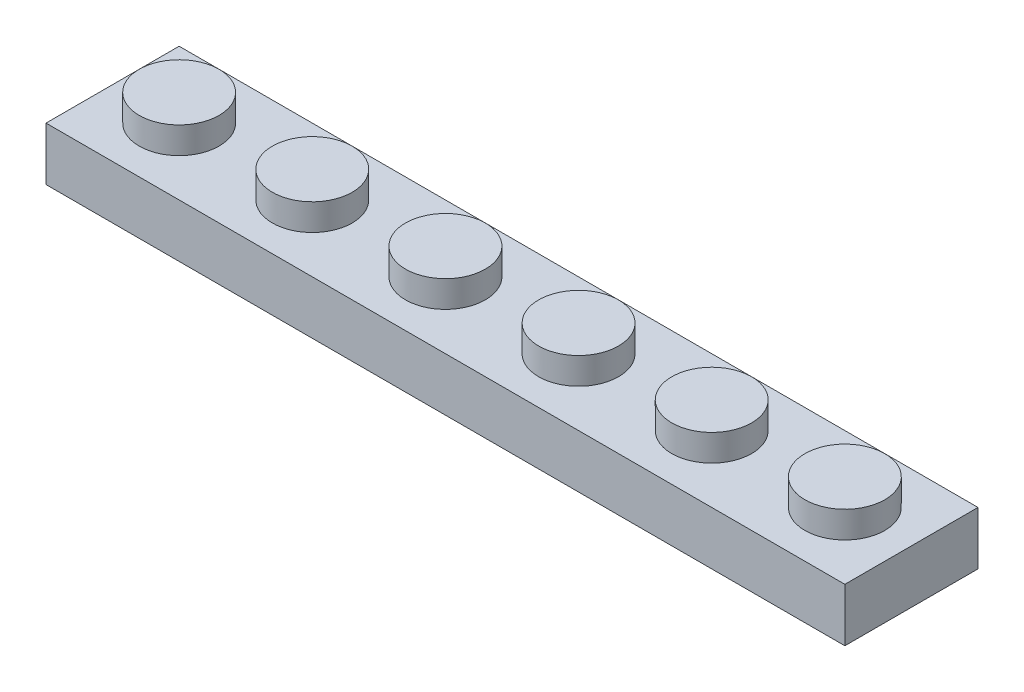
ISO-10303-21;
HEADER;
FILE_DESCRIPTION(('STEP AP214'),'2;1');
FILE_NAME('part.step','',(''),(''),'','','');
FILE_SCHEMA(('AUTOMOTIVE_DESIGN { 1 0 10303 214 1 1 1 1 }'));
ENDSEC;
DATA;
#1=APPLICATION_CONTEXT('core data for automotive mechanical design processes');
#2=APPLICATION_PROTOCOL_DEFINITION('international standard','automotive_design',2000,#1);
#3=PRODUCT_CONTEXT('',#1,'mechanical');
#4=PRODUCT('Part','Part','',(#3));
#5=PRODUCT_RELATED_PRODUCT_CATEGORY('part','',(#4));
#6=PRODUCT_DEFINITION_FORMATION('','',#4);
#7=PRODUCT_DEFINITION_CONTEXT('part definition',#1,'design');
#8=PRODUCT_DEFINITION('design','',#6,#7);
#9=PRODUCT_DEFINITION_SHAPE('','',#8);
#10=(LENGTH_UNIT() NAMED_UNIT(*) SI_UNIT(.MILLI.,.METRE.));
#11=(NAMED_UNIT(*) PLANE_ANGLE_UNIT() SI_UNIT($,.RADIAN.));
#12=(NAMED_UNIT(*) SI_UNIT($,.STERADIAN.) SOLID_ANGLE_UNIT());
#13=UNCERTAINTY_MEASURE_WITH_UNIT(LENGTH_MEASURE(1.E-05),#10,'distance_accuracy_value','');
#14=(GEOMETRIC_REPRESENTATION_CONTEXT(3) GLOBAL_UNCERTAINTY_ASSIGNED_CONTEXT((#13)) GLOBAL_UNIT_ASSIGNED_CONTEXT((#10,
#11,#12)) REPRESENTATION_CONTEXT('',''));
#15=CARTESIAN_POINT('',(0.,0.,0.));
#16=DIRECTION('',(0.,0.,1.));
#17=DIRECTION('',(1.,0.,0.));
#18=AXIS2_PLACEMENT_3D('',#15,#16,#17);
#19=CARTESIAN_POINT('',(44.,1.6,4.));
#20=DIRECTION('',(-1.,0.,0.));
#21=DIRECTION('',(0.,0.,1.));
#22=AXIS2_PLACEMENT_3D('',#19,#20,#21);
#23=PLANE('',#22);
#24=DIRECTION('',(0.,0.,-1.));
#25=VECTOR('',#24,1.);
#26=CARTESIAN_POINT('',(44.,3.2,4.));
#27=LINE('',#26,#25);
#28=CARTESIAN_POINT('',(44.,3.2,4.));
#29=VERTEX_POINT('',#28);
#30=CARTESIAN_POINT('',(44.,3.2,-4.));
#31=VERTEX_POINT('',#30);
#32=EDGE_CURVE('E11',#29,#31,#27,.T.);
#33=ORIENTED_EDGE('',*,*,#32,.F.);
#34=DIRECTION('',(0.,1.,0.));
#35=VECTOR('',#34,1.);
#36=CARTESIAN_POINT('',(44.,0.,4.));
#37=LINE('',#36,#35);
#38=CARTESIAN_POINT('',(44.,0.,4.));
#39=VERTEX_POINT('',#38);
#40=EDGE_CURVE('E165',#39,#29,#37,.T.);
#41=ORIENTED_EDGE('',*,*,#40,.F.);
#42=DIRECTION('',(0.,0.,-1.));
#43=VECTOR('',#42,1.);
#44=CARTESIAN_POINT('',(44.,0.,4.));
#45=LINE('',#44,#43);
#46=CARTESIAN_POINT('',(44.,0.,-4.));
#47=VERTEX_POINT('',#46);
#48=EDGE_CURVE('E174',#39,#47,#45,.T.);
#49=ORIENTED_EDGE('',*,*,#48,.T.);
#50=DIRECTION('',(0.,-1.,0.));
#51=VECTOR('',#50,1.);
#52=CARTESIAN_POINT('',(44.,1.6,-4.));
#53=LINE('',#52,#51);
#54=EDGE_CURVE('E226',#31,#47,#53,.T.);
#55=ORIENTED_EDGE('',*,*,#54,.F.);
#56=EDGE_LOOP('',(#33,#41,#49,#55));
#57=FACE_BOUND('',#56,.T.);
#58=ADVANCED_FACE('F43',(#57),#23,.F.);
#59=CARTESIAN_POINT('',(20.,3.2,4.));
#60=DIRECTION('',(0.,-1.,0.));
#61=DIRECTION('',(0.,0.,-1.));
#62=AXIS2_PLACEMENT_3D('',#59,#60,#61);
#63=PLANE('',#62);
#64=DIRECTION('',(1.,0.,0.));
#65=VECTOR('',#64,1.);
#66=CARTESIAN_POINT('',(20.,3.2,4.));
#67=LINE('',#66,#65);
#68=CARTESIAN_POINT('',(-4.,3.2,4.));
#69=VERTEX_POINT('',#68);
#70=EDGE_CURVE('E205',#69,#29,#67,.T.);
#71=ORIENTED_EDGE('',*,*,#70,.T.);
#72=ORIENTED_EDGE('',*,*,#32,.T.);
#73=DIRECTION('',(1.,0.,0.));
#74=VECTOR('',#73,1.);
#75=CARTESIAN_POINT('',(20.,3.2,-4.));
#76=LINE('',#75,#74);
#77=CARTESIAN_POINT('',(-4.,3.2,-4.));
#78=VERTEX_POINT('',#77);
#79=EDGE_CURVE('E183',#78,#31,#76,.T.);
#80=ORIENTED_EDGE('',*,*,#79,.F.);
#81=DIRECTION('',(0.,0.,-1.));
#82=VECTOR('',#81,1.);
#83=CARTESIAN_POINT('',(-4.,3.2,4.));
#84=LINE('',#83,#82);
#85=EDGE_CURVE('E53',#69,#78,#84,.T.);
#86=ORIENTED_EDGE('',*,*,#85,.F.);
#87=EDGE_LOOP('',(#71,#72,#80,#86));
#88=FACE_BOUND('',#87,.T.);
#89=CARTESIAN_POINT('',(0.,3.2,0.));
#90=DIRECTION('',(0.,-1.,0.));
#91=DIRECTION('',(1.,0.,0.));
#92=AXIS2_PLACEMENT_3D('',#89,#90,#91);
#93=CIRCLE('',#92,2.4);
#94=CARTESIAN_POINT('',(-2.4,3.2,0.));
#95=VERTEX_POINT('',#94);
#96=EDGE_CURVE('E224',#95,#95,#93,.T.);
#97=ORIENTED_EDGE('',*,*,#96,.T.);
#98=EDGE_LOOP('',(#97));
#99=FACE_BOUND('',#98,.T.);
#100=CARTESIAN_POINT('',(8.,3.2,0.));
#101=DIRECTION('',(0.,-1.,0.));
#102=DIRECTION('',(1.,0.,0.));
#103=AXIS2_PLACEMENT_3D('',#100,#101,#102);
#104=CIRCLE('',#103,2.4);
#105=CARTESIAN_POINT('',(5.6,3.2,0.));
#106=VERTEX_POINT('',#105);
#107=EDGE_CURVE('E216',#106,#106,#104,.T.);
#108=ORIENTED_EDGE('',*,*,#107,.T.);
#109=EDGE_LOOP('',(#108));
#110=FACE_BOUND('',#109,.T.);
#111=CARTESIAN_POINT('',(16.,3.2,0.));
#112=DIRECTION('',(0.,-1.,0.));
#113=DIRECTION('',(1.,0.,0.));
#114=AXIS2_PLACEMENT_3D('',#111,#112,#113);
#115=CIRCLE('',#114,2.4);
#116=CARTESIAN_POINT('',(13.6,3.2,0.));
#117=VERTEX_POINT('',#116);
#118=EDGE_CURVE('E206',#117,#117,#115,.T.);
#119=ORIENTED_EDGE('',*,*,#118,.T.);
#120=EDGE_LOOP('',(#119));
#121=FACE_BOUND('',#120,.T.);
#122=CARTESIAN_POINT('',(24.,3.2,0.));
#123=DIRECTION('',(0.,-1.,0.));
#124=DIRECTION('',(1.,0.,0.));
#125=AXIS2_PLACEMENT_3D('',#122,#123,#124);
#126=CIRCLE('',#125,2.4);
#127=CARTESIAN_POINT('',(21.6,3.2,0.));
#128=VERTEX_POINT('',#127);
#129=EDGE_CURVE('E228',#128,#128,#126,.T.);
#130=ORIENTED_EDGE('',*,*,#129,.T.);
#131=EDGE_LOOP('',(#130));
#132=FACE_BOUND('',#131,.T.);
#133=CARTESIAN_POINT('',(32.,3.2,0.));
#134=DIRECTION('',(0.,-1.,0.));
#135=DIRECTION('',(1.,0.,0.));
#136=AXIS2_PLACEMENT_3D('',#133,#134,#135);
#137=CIRCLE('',#136,2.4);
#138=CARTESIAN_POINT('',(29.6,3.2,0.));
#139=VERTEX_POINT('',#138);
#140=EDGE_CURVE('E191',#139,#139,#137,.T.);
#141=ORIENTED_EDGE('',*,*,#140,.T.);
#142=EDGE_LOOP('',(#141));
#143=FACE_BOUND('',#142,.T.);
#144=CARTESIAN_POINT('',(40.,3.2,0.));
#145=DIRECTION('',(0.,-1.,0.));
#146=DIRECTION('',(1.,0.,0.));
#147=AXIS2_PLACEMENT_3D('',#144,#145,#146);
#148=CIRCLE('',#147,2.4);
#149=CARTESIAN_POINT('',(37.6,3.2,0.));
#150=VERTEX_POINT('',#149);
#151=EDGE_CURVE('E141',#150,#150,#148,.T.);
#152=ORIENTED_EDGE('',*,*,#151,.T.);
#153=EDGE_LOOP('',(#152));
#154=FACE_BOUND('',#153,.T.);
#155=ADVANCED_FACE('F242',(#88,#99,#110,#121,#132,#143,#154),#63,.F.);
#156=CARTESIAN_POINT('',(-4.,1.6,4.));
#157=DIRECTION('',(1.,0.,0.));
#158=DIRECTION('',(0.,0.,-1.));
#159=AXIS2_PLACEMENT_3D('',#156,#157,#158);
#160=PLANE('',#159);
#161=DIRECTION('',(0.,0.,-1.));
#162=VECTOR('',#161,1.);
#163=CARTESIAN_POINT('',(-4.,0.,4.));
#164=LINE('',#163,#162);
#165=CARTESIAN_POINT('',(-4.,0.,4.));
#166=VERTEX_POINT('',#165);
#167=CARTESIAN_POINT('',(-4.,0.,-4.));
#168=VERTEX_POINT('',#167);
#169=EDGE_CURVE('E47',#166,#168,#164,.T.);
#170=ORIENTED_EDGE('',*,*,#169,.F.);
#171=DIRECTION('',(0.,1.,0.));
#172=VECTOR('',#171,1.);
#173=CARTESIAN_POINT('',(-4.,0.,4.));
#174=LINE('',#173,#172);
#175=EDGE_CURVE('E167',#166,#69,#174,.T.);
#176=ORIENTED_EDGE('',*,*,#175,.T.);
#177=ORIENTED_EDGE('',*,*,#85,.T.);
#178=DIRECTION('',(0.,1.,0.));
#179=VECTOR('',#178,1.);
#180=CARTESIAN_POINT('',(-4.,1.6,-4.));
#181=LINE('',#180,#179);
#182=EDGE_CURVE('E190',#168,#78,#181,.T.);
#183=ORIENTED_EDGE('',*,*,#182,.F.);
#184=EDGE_LOOP('',(#170,#176,#177,#183));
#185=FACE_BOUND('',#184,.T.);
#186=ADVANCED_FACE('F276',(#185),#160,.F.);
#187=CARTESIAN_POINT('',(20.,0.,4.));
#188=DIRECTION('',(0.,1.,0.));
#189=DIRECTION('',(0.,0.,1.));
#190=AXIS2_PLACEMENT_3D('',#187,#188,#189);
#191=PLANE('',#190);
#192=CARTESIAN_POINT('',(0.,0.,0.));
#193=DIRECTION('',(0.,1.,0.));
#194=DIRECTION('',(1.,0.,0.));
#195=AXIS2_PLACEMENT_3D('',#192,#193,#194);
#196=CIRCLE('',#195,2.4);
#197=CARTESIAN_POINT('',(-2.4,0.,0.));
#198=VERTEX_POINT('',#197);
#199=EDGE_CURVE('E100',#198,#198,#196,.T.);
#200=ORIENTED_EDGE('',*,*,#199,.T.);
#201=EDGE_LOOP('',(#200));
#202=FACE_BOUND('',#201,.T.);
#203=CARTESIAN_POINT('',(8.,0.,0.));
#204=DIRECTION('',(0.,1.,0.));
#205=DIRECTION('',(1.,0.,0.));
#206=AXIS2_PLACEMENT_3D('',#203,#204,#205);
#207=CIRCLE('',#206,2.4);
#208=CARTESIAN_POINT('',(5.6,0.,0.));
#209=VERTEX_POINT('',#208);
#210=EDGE_CURVE('E194',#209,#209,#207,.T.);
#211=ORIENTED_EDGE('',*,*,#210,.T.);
#212=EDGE_LOOP('',(#211));
#213=FACE_BOUND('',#212,.T.);
#214=CARTESIAN_POINT('',(16.,0.,0.));
#215=DIRECTION('',(0.,1.,0.));
#216=DIRECTION('',(1.,0.,0.));
#217=AXIS2_PLACEMENT_3D('',#214,#215,#216);
#218=CIRCLE('',#217,2.4);
#219=CARTESIAN_POINT('',(13.6,0.,0.));
#220=VERTEX_POINT('',#219);
#221=EDGE_CURVE('E211',#220,#220,#218,.T.);
#222=ORIENTED_EDGE('',*,*,#221,.T.);
#223=EDGE_LOOP('',(#222));
#224=FACE_BOUND('',#223,.T.);
#225=CARTESIAN_POINT('',(24.,0.,0.));
#226=DIRECTION('',(0.,1.,0.));
#227=DIRECTION('',(1.,0.,0.));
#228=AXIS2_PLACEMENT_3D('',#225,#226,#227);
#229=CIRCLE('',#228,2.4);
#230=CARTESIAN_POINT('',(21.6,0.,0.));
#231=VERTEX_POINT('',#230);
#232=EDGE_CURVE('E197',#231,#231,#229,.T.);
#233=ORIENTED_EDGE('',*,*,#232,.T.);
#234=EDGE_LOOP('',(#233));
#235=FACE_BOUND('',#234,.T.);
#236=CARTESIAN_POINT('',(32.,0.,0.));
#237=DIRECTION('',(0.,1.,0.));
#238=DIRECTION('',(1.,0.,0.));
#239=AXIS2_PLACEMENT_3D('',#236,#237,#238);
#240=CIRCLE('',#239,2.4);
#241=CARTESIAN_POINT('',(29.6,0.,0.));
#242=VERTEX_POINT('',#241);
#243=EDGE_CURVE('E219',#242,#242,#240,.T.);
#244=ORIENTED_EDGE('',*,*,#243,.T.);
#245=EDGE_LOOP('',(#244));
#246=FACE_BOUND('',#245,.T.);
#247=CARTESIAN_POINT('',(40.,0.,0.));
#248=DIRECTION('',(0.,1.,0.));
#249=DIRECTION('',(1.,0.,0.));
#250=AXIS2_PLACEMENT_3D('',#247,#248,#249);
#251=CIRCLE('',#250,2.4);
#252=CARTESIAN_POINT('',(37.6,0.,0.));
#253=VERTEX_POINT('',#252);
#254=EDGE_CURVE('E202',#253,#253,#251,.T.);
#255=ORIENTED_EDGE('',*,*,#254,.T.);
#256=EDGE_LOOP('',(#255));
#257=FACE_BOUND('',#256,.T.);
#258=ORIENTED_EDGE('',*,*,#48,.F.);
#259=DIRECTION('',(-1.,0.,0.));
#260=VECTOR('',#259,1.);
#261=CARTESIAN_POINT('',(0.,0.,4.));
#262=LINE('',#261,#260);
#263=EDGE_CURVE('E162',#39,#166,#262,.T.);
#264=ORIENTED_EDGE('',*,*,#263,.T.);
#265=ORIENTED_EDGE('',*,*,#169,.T.);
#266=DIRECTION('',(-1.,0.,0.));
#267=VECTOR('',#266,1.);
#268=CARTESIAN_POINT('',(20.,0.,-4.));
#269=LINE('',#268,#267);
#270=EDGE_CURVE('E179',#47,#168,#269,.T.);
#271=ORIENTED_EDGE('',*,*,#270,.F.);
#272=EDGE_LOOP('',(#258,#264,#265,#271));
#273=FACE_BOUND('',#272,.T.);
#274=ADVANCED_FACE('F177',(#202,#213,#224,#235,#246,#257,#273),#191,.F.);
#275=CARTESIAN_POINT('',(20.,1.6,-4.));
#276=DIRECTION('',(0.,0.,1.));
#277=DIRECTION('',(1.,0.,0.));
#278=AXIS2_PLACEMENT_3D('',#275,#276,#277);
#279=PLANE('',#278);
#280=ORIENTED_EDGE('',*,*,#54,.T.);
#281=ORIENTED_EDGE('',*,*,#270,.T.);
#282=ORIENTED_EDGE('',*,*,#182,.T.);
#283=ORIENTED_EDGE('',*,*,#79,.T.);
#284=EDGE_LOOP('',(#280,#281,#282,#283));
#285=FACE_BOUND('',#284,.T.);
#286=ADVANCED_FACE('F240',(#285),#279,.F.);
#287=CARTESIAN_POINT('',(0.,4.8,0.));
#288=DIRECTION('',(0.,1.,0.));
#289=DIRECTION('',(1.,0.,0.));
#290=AXIS2_PLACEMENT_3D('',#287,#288,#289);
#291=PLANE('',#290);
#292=CARTESIAN_POINT('',(0.,4.8,0.));
#293=DIRECTION('',(0.,1.,0.));
#294=DIRECTION('',(1.,0.,0.));
#295=AXIS2_PLACEMENT_3D('',#292,#293,#294);
#296=CIRCLE('',#295,2.4);
#297=CARTESIAN_POINT('',(2.4,4.8,0.));
#298=VERTEX_POINT('',#297);
#299=EDGE_CURVE('E186',#298,#298,#296,.T.);
#300=ORIENTED_EDGE('',*,*,#299,.T.);
#301=EDGE_LOOP('',(#300));
#302=FACE_BOUND('',#301,.T.);
#303=ADVANCED_FACE('F294',(#302),#291,.T.);
#304=CARTESIAN_POINT('',(0.,3.75,0.));
#305=DIRECTION('',(0.,-1.,0.));
#306=DIRECTION('',(1.,0.,0.));
#307=AXIS2_PLACEMENT_3D('',#304,#305,#306);
#308=CYLINDRICAL_SURFACE('',#307,2.4);
#309=ORIENTED_EDGE('',*,*,#96,.F.);
#310=EDGE_LOOP('',(#309));
#311=FACE_BOUND('',#310,.T.);
#312=ORIENTED_EDGE('',*,*,#299,.F.);
#313=EDGE_LOOP('',(#312));
#314=FACE_BOUND('',#313,.T.);
#315=ADVANCED_FACE('F292',(#311,#314),#308,.T.);
#316=CARTESIAN_POINT('',(8.,4.8,0.));
#317=DIRECTION('',(0.,1.,0.));
#318=DIRECTION('',(1.,0.,0.));
#319=AXIS2_PLACEMENT_3D('',#316,#317,#318);
#320=PLANE('',#319);
#321=CARTESIAN_POINT('',(8.,4.8,0.));
#322=DIRECTION('',(0.,1.,0.));
#323=DIRECTION('',(1.,0.,0.));
#324=AXIS2_PLACEMENT_3D('',#321,#322,#323);
#325=CIRCLE('',#324,2.4);
#326=CARTESIAN_POINT('',(10.4,4.8,0.));
#327=VERTEX_POINT('',#326);
#328=EDGE_CURVE('E208',#327,#327,#325,.T.);
#329=ORIENTED_EDGE('',*,*,#328,.T.);
#330=EDGE_LOOP('',(#329));
#331=FACE_BOUND('',#330,.T.);
#332=ADVANCED_FACE('F288',(#331),#320,.T.);
#333=CARTESIAN_POINT('',(8.,3.75,0.));
#334=DIRECTION('',(0.,-1.,0.));
#335=DIRECTION('',(1.,0.,0.));
#336=AXIS2_PLACEMENT_3D('',#333,#334,#335);
#337=CYLINDRICAL_SURFACE('',#336,2.4);
#338=ORIENTED_EDGE('',*,*,#107,.F.);
#339=EDGE_LOOP('',(#338));
#340=FACE_BOUND('',#339,.T.);
#341=ORIENTED_EDGE('',*,*,#328,.F.);
#342=EDGE_LOOP('',(#341));
#343=FACE_BOUND('',#342,.T.);
#344=ADVANCED_FACE('F291',(#340,#343),#337,.T.);
#345=CARTESIAN_POINT('',(16.,4.8,0.));
#346=DIRECTION('',(0.,1.,0.));
#347=DIRECTION('',(1.,0.,0.));
#348=AXIS2_PLACEMENT_3D('',#345,#346,#347);
#349=PLANE('',#348);
#350=CARTESIAN_POINT('',(16.,4.8,0.));
#351=DIRECTION('',(0.,1.,0.));
#352=DIRECTION('',(1.,0.,0.));
#353=AXIS2_PLACEMENT_3D('',#350,#351,#352);
#354=CIRCLE('',#353,2.4);
#355=CARTESIAN_POINT('',(18.4,4.8,0.));
#356=VERTEX_POINT('',#355);
#357=EDGE_CURVE('E209',#356,#356,#354,.T.);
#358=ORIENTED_EDGE('',*,*,#357,.T.);
#359=EDGE_LOOP('',(#358));
#360=FACE_BOUND('',#359,.T.);
#361=ADVANCED_FACE('F357',(#360),#349,.T.);
#362=CARTESIAN_POINT('',(16.,3.75,0.));
#363=DIRECTION('',(0.,-1.,0.));
#364=DIRECTION('',(1.,0.,0.));
#365=AXIS2_PLACEMENT_3D('',#362,#363,#364);
#366=CYLINDRICAL_SURFACE('',#365,2.4);
#367=ORIENTED_EDGE('',*,*,#118,.F.);
#368=EDGE_LOOP('',(#367));
#369=FACE_BOUND('',#368,.T.);
#370=ORIENTED_EDGE('',*,*,#357,.F.);
#371=EDGE_LOOP('',(#370));
#372=FACE_BOUND('',#371,.T.);
#373=ADVANCED_FACE('F285',(#369,#372),#366,.T.);
#374=CARTESIAN_POINT('',(24.,4.8,0.));
#375=DIRECTION('',(0.,1.,0.));
#376=DIRECTION('',(1.,0.,0.));
#377=AXIS2_PLACEMENT_3D('',#374,#375,#376);
#378=PLANE('',#377);
#379=CARTESIAN_POINT('',(24.,4.8,0.));
#380=DIRECTION('',(0.,1.,0.));
#381=DIRECTION('',(1.,0.,0.));
#382=AXIS2_PLACEMENT_3D('',#379,#380,#381);
#383=CIRCLE('',#382,2.4);
#384=CARTESIAN_POINT('',(26.4,4.8,0.));
#385=VERTEX_POINT('',#384);
#386=EDGE_CURVE('E193',#385,#385,#383,.T.);
#387=ORIENTED_EDGE('',*,*,#386,.T.);
#388=EDGE_LOOP('',(#387));
#389=FACE_BOUND('',#388,.T.);
#390=ADVANCED_FACE('F282',(#389),#378,.T.);
#391=CARTESIAN_POINT('',(24.,3.75,0.));
#392=DIRECTION('',(0.,-1.,0.));
#393=DIRECTION('',(1.,0.,0.));
#394=AXIS2_PLACEMENT_3D('',#391,#392,#393);
#395=CYLINDRICAL_SURFACE('',#394,2.4);
#396=ORIENTED_EDGE('',*,*,#129,.F.);
#397=EDGE_LOOP('',(#396));
#398=FACE_BOUND('',#397,.T.);
#399=ORIENTED_EDGE('',*,*,#386,.F.);
#400=EDGE_LOOP('',(#399));
#401=FACE_BOUND('',#400,.T.);
#402=ADVANCED_FACE('F284',(#398,#401),#395,.T.);
#403=CARTESIAN_POINT('',(32.,4.8,0.));
#404=DIRECTION('',(0.,1.,0.));
#405=DIRECTION('',(1.,0.,0.));
#406=AXIS2_PLACEMENT_3D('',#403,#404,#405);
#407=PLANE('',#406);
#408=CARTESIAN_POINT('',(32.,4.8,0.));
#409=DIRECTION('',(0.,1.,0.));
#410=DIRECTION('',(1.,0.,0.));
#411=AXIS2_PLACEMENT_3D('',#408,#409,#410);
#412=CIRCLE('',#411,2.4);
#413=CARTESIAN_POINT('',(34.4,4.8,0.));
#414=VERTEX_POINT('',#413);
#415=EDGE_CURVE('E146',#414,#414,#412,.T.);
#416=ORIENTED_EDGE('',*,*,#415,.T.);
#417=EDGE_LOOP('',(#416));
#418=FACE_BOUND('',#417,.T.);
#419=ADVANCED_FACE('F305',(#418),#407,.T.);
#420=CARTESIAN_POINT('',(32.,3.75,0.));
#421=DIRECTION('',(0.,-1.,0.));
#422=DIRECTION('',(1.,0.,0.));
#423=AXIS2_PLACEMENT_3D('',#420,#421,#422);
#424=CYLINDRICAL_SURFACE('',#423,2.4);
#425=ORIENTED_EDGE('',*,*,#140,.F.);
#426=EDGE_LOOP('',(#425));
#427=FACE_BOUND('',#426,.T.);
#428=ORIENTED_EDGE('',*,*,#415,.F.);
#429=EDGE_LOOP('',(#428));
#430=FACE_BOUND('',#429,.T.);
#431=ADVANCED_FACE('F308',(#427,#430),#424,.T.);
#432=CARTESIAN_POINT('',(40.,4.8,0.));
#433=DIRECTION('',(0.,1.,0.));
#434=DIRECTION('',(1.,0.,0.));
#435=AXIS2_PLACEMENT_3D('',#432,#433,#434);
#436=PLANE('',#435);
#437=CARTESIAN_POINT('',(40.,4.8,0.));
#438=DIRECTION('',(0.,1.,0.));
#439=DIRECTION('',(1.,0.,0.));
#440=AXIS2_PLACEMENT_3D('',#437,#438,#439);
#441=CIRCLE('',#440,2.4);
#442=CARTESIAN_POINT('',(42.4,4.8,0.));
#443=VERTEX_POINT('',#442);
#444=EDGE_CURVE('E214',#443,#443,#441,.T.);
#445=ORIENTED_EDGE('',*,*,#444,.T.);
#446=EDGE_LOOP('',(#445));
#447=FACE_BOUND('',#446,.T.);
#448=ADVANCED_FACE('F341',(#447),#436,.T.);
#449=CARTESIAN_POINT('',(40.,3.75,0.));
#450=DIRECTION('',(0.,-1.,0.));
#451=DIRECTION('',(1.,0.,0.));
#452=AXIS2_PLACEMENT_3D('',#449,#450,#451);
#453=CYLINDRICAL_SURFACE('',#452,2.4);
#454=ORIENTED_EDGE('',*,*,#151,.F.);
#455=EDGE_LOOP('',(#454));
#456=FACE_BOUND('',#455,.T.);
#457=ORIENTED_EDGE('',*,*,#444,.F.);
#458=EDGE_LOOP('',(#457));
#459=FACE_BOUND('',#458,.T.);
#460=ADVANCED_FACE('F45',(#456,#459),#453,.T.);
#461=CARTESIAN_POINT('',(0.,1.6,0.));
#462=DIRECTION('',(0.,1.,0.));
#463=DIRECTION('',(1.,0.,0.));
#464=AXIS2_PLACEMENT_3D('',#461,#462,#463);
#465=PLANE('',#464);
#466=CARTESIAN_POINT('',(0.,1.6,0.));
#467=DIRECTION('',(0.,1.,0.));
#468=DIRECTION('',(1.,0.,0.));
#469=AXIS2_PLACEMENT_3D('',#466,#467,#468);
#470=CIRCLE('',#469,2.4);
#471=CARTESIAN_POINT('',(2.4,1.6,0.));
#472=VERTEX_POINT('',#471);
#473=EDGE_CURVE('E212',#472,#472,#470,.T.);
#474=ORIENTED_EDGE('',*,*,#473,.F.);
#475=EDGE_LOOP('',(#474));
#476=FACE_BOUND('',#475,.T.);
#477=ADVANCED_FACE('F309',(#476),#465,.F.);
#478=CARTESIAN_POINT('',(0.,0.55,0.));
#479=DIRECTION('',(0.,-1.,0.));
#480=DIRECTION('',(1.,0.,0.));
#481=AXIS2_PLACEMENT_3D('',#478,#479,#480);
#482=CYLINDRICAL_SURFACE('',#481,2.4);
#483=ORIENTED_EDGE('',*,*,#473,.T.);
#484=EDGE_LOOP('',(#483));
#485=FACE_BOUND('',#484,.T.);
#486=ORIENTED_EDGE('',*,*,#199,.F.);
#487=EDGE_LOOP('',(#486));
#488=FACE_BOUND('',#487,.T.);
#489=ADVANCED_FACE('F280',(#485,#488),#482,.F.);
#490=CARTESIAN_POINT('',(8.,1.6,0.));
#491=DIRECTION('',(0.,1.,0.));
#492=DIRECTION('',(1.,0.,0.));
#493=AXIS2_PLACEMENT_3D('',#490,#491,#492);
#494=PLANE('',#493);
#495=CARTESIAN_POINT('',(8.,1.6,0.));
#496=DIRECTION('',(0.,1.,0.));
#497=DIRECTION('',(1.,0.,0.));
#498=AXIS2_PLACEMENT_3D('',#495,#496,#497);
#499=CIRCLE('',#498,2.4);
#500=CARTESIAN_POINT('',(10.4,1.6,0.));
#501=VERTEX_POINT('',#500);
#502=EDGE_CURVE('E105',#501,#501,#499,.T.);
#503=ORIENTED_EDGE('',*,*,#502,.F.);
#504=EDGE_LOOP('',(#503));
#505=FACE_BOUND('',#504,.T.);
#506=ADVANCED_FACE('F301',(#505),#494,.F.);
#507=CARTESIAN_POINT('',(8.,0.55,0.));
#508=DIRECTION('',(0.,-1.,0.));
#509=DIRECTION('',(1.,0.,0.));
#510=AXIS2_PLACEMENT_3D('',#507,#508,#509);
#511=CYLINDRICAL_SURFACE('',#510,2.4);
#512=ORIENTED_EDGE('',*,*,#502,.T.);
#513=EDGE_LOOP('',(#512));
#514=FACE_BOUND('',#513,.T.);
#515=ORIENTED_EDGE('',*,*,#210,.F.);
#516=EDGE_LOOP('',(#515));
#517=FACE_BOUND('',#516,.T.);
#518=ADVANCED_FACE('F298',(#514,#517),#511,.F.);
#519=CARTESIAN_POINT('',(16.,1.6,0.));
#520=DIRECTION('',(0.,1.,0.));
#521=DIRECTION('',(1.,0.,0.));
#522=AXIS2_PLACEMENT_3D('',#519,#520,#521);
#523=PLANE('',#522);
#524=CARTESIAN_POINT('',(16.,1.6,0.));
#525=DIRECTION('',(0.,1.,0.));
#526=DIRECTION('',(1.,0.,0.));
#527=AXIS2_PLACEMENT_3D('',#524,#525,#526);
#528=CIRCLE('',#527,2.4);
#529=CARTESIAN_POINT('',(18.4,1.6,0.));
#530=VERTEX_POINT('',#529);
#531=EDGE_CURVE('E196',#530,#530,#528,.T.);
#532=ORIENTED_EDGE('',*,*,#531,.F.);
#533=EDGE_LOOP('',(#532));
#534=FACE_BOUND('',#533,.T.);
#535=ADVANCED_FACE('F264',(#534),#523,.F.);
#536=CARTESIAN_POINT('',(16.,0.55,0.));
#537=DIRECTION('',(0.,-1.,0.));
#538=DIRECTION('',(1.,0.,0.));
#539=AXIS2_PLACEMENT_3D('',#536,#537,#538);
#540=CYLINDRICAL_SURFACE('',#539,2.4);
#541=ORIENTED_EDGE('',*,*,#531,.T.);
#542=EDGE_LOOP('',(#541));
#543=FACE_BOUND('',#542,.T.);
#544=ORIENTED_EDGE('',*,*,#221,.F.);
#545=EDGE_LOOP('',(#544));
#546=FACE_BOUND('',#545,.T.);
#547=ADVANCED_FACE('F253',(#543,#546),#540,.F.);
#548=CARTESIAN_POINT('',(24.,1.6,0.));
#549=DIRECTION('',(0.,1.,0.));
#550=DIRECTION('',(1.,0.,0.));
#551=AXIS2_PLACEMENT_3D('',#548,#549,#550);
#552=PLANE('',#551);
#553=CARTESIAN_POINT('',(24.,1.6,0.));
#554=DIRECTION('',(0.,1.,0.));
#555=DIRECTION('',(1.,0.,0.));
#556=AXIS2_PLACEMENT_3D('',#553,#554,#555);
#557=CIRCLE('',#556,2.4);
#558=CARTESIAN_POINT('',(26.4,1.6,0.));
#559=VERTEX_POINT('',#558);
#560=EDGE_CURVE('E199',#559,#559,#557,.T.);
#561=ORIENTED_EDGE('',*,*,#560,.F.);
#562=EDGE_LOOP('',(#561));
#563=FACE_BOUND('',#562,.T.);
#564=ADVANCED_FACE('F251',(#563),#552,.F.);
#565=CARTESIAN_POINT('',(24.,0.55,0.));
#566=DIRECTION('',(0.,-1.,0.));
#567=DIRECTION('',(1.,0.,0.));
#568=AXIS2_PLACEMENT_3D('',#565,#566,#567);
#569=CYLINDRICAL_SURFACE('',#568,2.4);
#570=ORIENTED_EDGE('',*,*,#560,.T.);
#571=EDGE_LOOP('',(#570));
#572=FACE_BOUND('',#571,.T.);
#573=ORIENTED_EDGE('',*,*,#232,.F.);
#574=EDGE_LOOP('',(#573));
#575=FACE_BOUND('',#574,.T.);
#576=ADVANCED_FACE('F248',(#572,#575),#569,.F.);
#577=CARTESIAN_POINT('',(32.,1.6,0.));
#578=DIRECTION('',(0.,1.,0.));
#579=DIRECTION('',(1.,0.,0.));
#580=AXIS2_PLACEMENT_3D('',#577,#578,#579);
#581=PLANE('',#580);
#582=CARTESIAN_POINT('',(32.,1.6,0.));
#583=DIRECTION('',(0.,1.,0.));
#584=DIRECTION('',(1.,0.,0.));
#585=AXIS2_PLACEMENT_3D('',#582,#583,#584);
#586=CIRCLE('',#585,2.4);
#587=CARTESIAN_POINT('',(34.4,1.6,0.));
#588=VERTEX_POINT('',#587);
#589=EDGE_CURVE('E200',#588,#588,#586,.T.);
#590=ORIENTED_EDGE('',*,*,#589,.F.);
#591=EDGE_LOOP('',(#590));
#592=FACE_BOUND('',#591,.T.);
#593=ADVANCED_FACE('F261',(#592),#581,.F.);
#594=CARTESIAN_POINT('',(32.,0.55,0.));
#595=DIRECTION('',(0.,-1.,0.));
#596=DIRECTION('',(1.,0.,0.));
#597=AXIS2_PLACEMENT_3D('',#594,#595,#596);
#598=CYLINDRICAL_SURFACE('',#597,2.4);
#599=ORIENTED_EDGE('',*,*,#589,.T.);
#600=EDGE_LOOP('',(#599));
#601=FACE_BOUND('',#600,.T.);
#602=ORIENTED_EDGE('',*,*,#243,.F.);
#603=EDGE_LOOP('',(#602));
#604=FACE_BOUND('',#603,.T.);
#605=ADVANCED_FACE('F315',(#601,#604),#598,.F.);
#606=CARTESIAN_POINT('',(40.,1.6,0.));
#607=DIRECTION('',(0.,1.,0.));
#608=DIRECTION('',(1.,0.,0.));
#609=AXIS2_PLACEMENT_3D('',#606,#607,#608);
#610=PLANE('',#609);
#611=CARTESIAN_POINT('',(40.,1.6,0.));
#612=DIRECTION('',(0.,1.,0.));
#613=DIRECTION('',(1.,0.,0.));
#614=AXIS2_PLACEMENT_3D('',#611,#612,#613);
#615=CIRCLE('',#614,2.4);
#616=CARTESIAN_POINT('',(42.4,1.6,0.));
#617=VERTEX_POINT('',#616);
#618=EDGE_CURVE('E204',#617,#617,#615,.T.);
#619=ORIENTED_EDGE('',*,*,#618,.F.);
#620=EDGE_LOOP('',(#619));
#621=FACE_BOUND('',#620,.T.);
#622=ADVANCED_FACE('F321',(#621),#610,.F.);
#623=CARTESIAN_POINT('',(40.,0.55,0.));
#624=DIRECTION('',(0.,-1.,0.));
#625=DIRECTION('',(1.,0.,0.));
#626=AXIS2_PLACEMENT_3D('',#623,#624,#625);
#627=CYLINDRICAL_SURFACE('',#626,2.4);
#628=ORIENTED_EDGE('',*,*,#618,.T.);
#629=EDGE_LOOP('',(#628));
#630=FACE_BOUND('',#629,.T.);
#631=ORIENTED_EDGE('',*,*,#254,.F.);
#632=EDGE_LOOP('',(#631));
#633=FACE_BOUND('',#632,.T.);
#634=ADVANCED_FACE('F326',(#630,#633),#627,.F.);
#635=CARTESIAN_POINT('',(0.,0.,4.));
#636=DIRECTION('',(0.,0.,-1.));
#637=DIRECTION('',(-1.,0.,0.));
#638=AXIS2_PLACEMENT_3D('',#635,#636,#637);
#639=PLANE('',#638);
#640=ORIENTED_EDGE('',*,*,#175,.F.);
#641=ORIENTED_EDGE('',*,*,#263,.F.);
#642=ORIENTED_EDGE('',*,*,#40,.T.);
#643=ORIENTED_EDGE('',*,*,#70,.F.);
#644=EDGE_LOOP('',(#640,#641,#642,#643));
#645=FACE_BOUND('',#644,.T.);
#646=ADVANCED_FACE('F164',(#645),#639,.F.);
#647=CLOSED_SHELL('',(#58,#155,#186,#274,#286,#303,#315,#332,#344,#361,#373,#390,#402,#419,#431,
#448,#460,#477,#489,#506,#518,#535,#547,#564,#576,#593,#605,#622,#634,#646));
#648=MANIFOLD_SOLID_BREP('B2',#647);
#649=ADVANCED_BREP_SHAPE_REPRESENTATION('',(#18,#648),#14);
#650=SHAPE_DEFINITION_REPRESENTATION(#9,#649);
ENDSEC;
END-ISO-10303-21;
